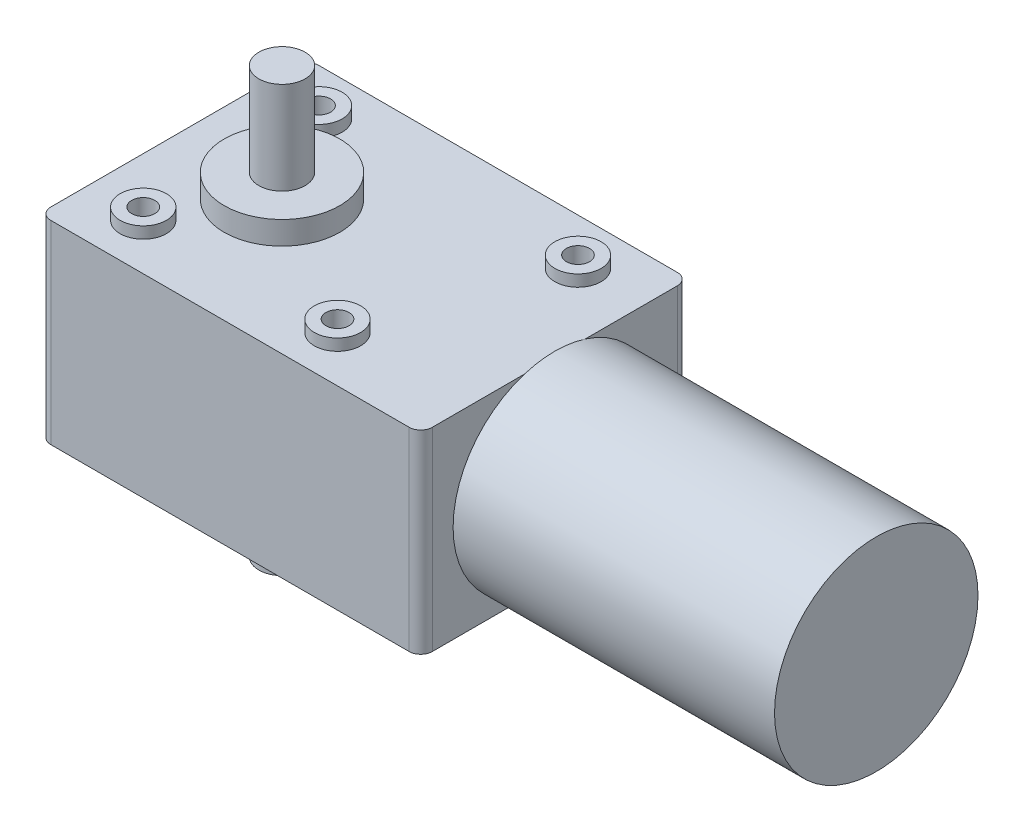
ISO-10303-21;
HEADER;
FILE_DESCRIPTION(('STEP AP214'),'2;1');
FILE_NAME('part.step','',(''),(''),'','','');
FILE_SCHEMA(('AUTOMOTIVE_DESIGN { 1 0 10303 214 1 1 1 1 }'));
ENDSEC;
DATA;
#1=APPLICATION_CONTEXT('core data for automotive mechanical design processes');
#2=APPLICATION_PROTOCOL_DEFINITION('international standard','automotive_design',2000,#1);
#3=PRODUCT_CONTEXT('',#1,'mechanical');
#4=PRODUCT('Part','Part','',(#3));
#5=PRODUCT_RELATED_PRODUCT_CATEGORY('part','',(#4));
#6=PRODUCT_DEFINITION_FORMATION('','',#4);
#7=PRODUCT_DEFINITION_CONTEXT('part definition',#1,'design');
#8=PRODUCT_DEFINITION('design','',#6,#7);
#9=PRODUCT_DEFINITION_SHAPE('','',#8);
#10=(LENGTH_UNIT() NAMED_UNIT(*) SI_UNIT(.MILLI.,.METRE.));
#11=(NAMED_UNIT(*) PLANE_ANGLE_UNIT() SI_UNIT($,.RADIAN.));
#12=(NAMED_UNIT(*) SI_UNIT($,.STERADIAN.) SOLID_ANGLE_UNIT());
#13=UNCERTAINTY_MEASURE_WITH_UNIT(LENGTH_MEASURE(1.E-05),#10,'distance_accuracy_value','');
#14=(GEOMETRIC_REPRESENTATION_CONTEXT(3) GLOBAL_UNCERTAINTY_ASSIGNED_CONTEXT((#13)) GLOBAL_UNIT_ASSIGNED_CONTEXT((#10,
#11,#12)) REPRESENTATION_CONTEXT('',''));
#15=CARTESIAN_POINT('',(0.,0.,0.));
#16=DIRECTION('',(0.,0.,1.));
#17=DIRECTION('',(1.,0.,0.));
#18=AXIS2_PLACEMENT_3D('',#15,#16,#17);
#19=CARTESIAN_POINT('',(-28.75,-23.5,19.));
#20=DIRECTION('',(0.,-1.,0.));
#21=DIRECTION('',(0.,0.,1.));
#22=AXIS2_PLACEMENT_3D('',#19,#20,#21);
#23=PLANE('',#22);
#24=CARTESIAN_POINT('',(-28.75,-23.5,19.));
#25=DIRECTION('',(0.,1.,0.));
#26=DIRECTION('',(0.,0.,1.));
#27=AXIS2_PLACEMENT_3D('',#24,#25,#26);
#28=CIRCLE('',#27,5.);
#29=CARTESIAN_POINT('',(-28.75,-23.5,24.));
#30=VERTEX_POINT('',#29);
#31=EDGE_CURVE('E350',#30,#30,#28,.T.);
#32=ORIENTED_EDGE('',*,*,#31,.F.);
#33=EDGE_LOOP('',(#32));
#34=FACE_BOUND('',#33,.T.);
#35=CARTESIAN_POINT('',(-28.75,-23.5,19.));
#36=DIRECTION('',(0.,1.,0.));
#37=DIRECTION('',(0.,0.,1.));
#38=AXIS2_PLACEMENT_3D('',#35,#36,#37);
#39=CIRCLE('',#38,2.5);
#40=CARTESIAN_POINT('',(-28.75,-23.5,21.5));
#41=VERTEX_POINT('',#40);
#42=EDGE_CURVE('E687',#41,#41,#39,.T.);
#43=ORIENTED_EDGE('',*,*,#42,.T.);
#44=EDGE_LOOP('',(#43));
#45=FACE_BOUND('',#44,.T.);
#46=ADVANCED_FACE('F33',(#34,#45),#23,.T.);
#47=CARTESIAN_POINT('',(13.25,-23.5,19.));
#48=DIRECTION('',(0.,-1.,0.));
#49=DIRECTION('',(0.,0.,1.));
#50=AXIS2_PLACEMENT_3D('',#47,#48,#49);
#51=PLANE('',#50);
#52=CARTESIAN_POINT('',(13.25,-23.5,19.));
#53=DIRECTION('',(0.,1.,0.));
#54=DIRECTION('',(0.,0.,1.));
#55=AXIS2_PLACEMENT_3D('',#52,#53,#54);
#56=CIRCLE('',#55,5.);
#57=CARTESIAN_POINT('',(13.25,-23.5,24.));
#58=VERTEX_POINT('',#57);
#59=EDGE_CURVE('E344',#58,#58,#56,.T.);
#60=ORIENTED_EDGE('',*,*,#59,.F.);
#61=EDGE_LOOP('',(#60));
#62=FACE_BOUND('',#61,.T.);
#63=CARTESIAN_POINT('',(13.25,-23.5,19.));
#64=DIRECTION('',(0.,1.,0.));
#65=DIRECTION('',(0.,0.,1.));
#66=AXIS2_PLACEMENT_3D('',#63,#64,#65);
#67=CIRCLE('',#66,2.5);
#68=CARTESIAN_POINT('',(13.25,-23.5,21.5));
#69=VERTEX_POINT('',#68);
#70=EDGE_CURVE('E692',#69,#69,#67,.T.);
#71=ORIENTED_EDGE('',*,*,#70,.T.);
#72=EDGE_LOOP('',(#71));
#73=FACE_BOUND('',#72,.T.);
#74=ADVANCED_FACE('F293',(#62,#73),#51,.T.);
#75=CARTESIAN_POINT('',(27.25,-23.5,-19.));
#76=DIRECTION('',(0.,-1.,0.));
#77=DIRECTION('',(0.,0.,1.));
#78=AXIS2_PLACEMENT_3D('',#75,#76,#77);
#79=PLANE('',#78);
#80=CARTESIAN_POINT('',(27.25,-23.5,-19.));
#81=DIRECTION('',(0.,1.,0.));
#82=DIRECTION('',(0.,0.,1.));
#83=AXIS2_PLACEMENT_3D('',#80,#81,#82);
#84=CIRCLE('',#83,5.);
#85=CARTESIAN_POINT('',(27.25,-23.5,-14.));
#86=VERTEX_POINT('',#85);
#87=EDGE_CURVE('E338',#86,#86,#84,.T.);
#88=ORIENTED_EDGE('',*,*,#87,.F.);
#89=EDGE_LOOP('',(#88));
#90=FACE_BOUND('',#89,.T.);
#91=CARTESIAN_POINT('',(27.25,-23.5,-19.));
#92=DIRECTION('',(0.,1.,0.));
#93=DIRECTION('',(0.,0.,1.));
#94=AXIS2_PLACEMENT_3D('',#91,#92,#93);
#95=CIRCLE('',#94,2.5);
#96=CARTESIAN_POINT('',(27.25,-23.5,-16.5));
#97=VERTEX_POINT('',#96);
#98=EDGE_CURVE('E334',#97,#97,#95,.T.);
#99=ORIENTED_EDGE('',*,*,#98,.T.);
#100=EDGE_LOOP('',(#99));
#101=FACE_BOUND('',#100,.T.);
#102=ADVANCED_FACE('F299',(#90,#101),#79,.T.);
#103=CARTESIAN_POINT('',(-28.75,-23.5,-19.));
#104=DIRECTION('',(0.,-1.,0.));
#105=DIRECTION('',(0.,0.,1.));
#106=AXIS2_PLACEMENT_3D('',#103,#104,#105);
#107=PLANE('',#106);
#108=CARTESIAN_POINT('',(-28.75,-23.5,-19.));
#109=DIRECTION('',(0.,1.,0.));
#110=DIRECTION('',(0.,0.,1.));
#111=AXIS2_PLACEMENT_3D('',#108,#109,#110);
#112=CIRCLE('',#111,5.);
#113=CARTESIAN_POINT('',(-28.75,-23.5,-14.));
#114=VERTEX_POINT('',#113);
#115=EDGE_CURVE('E132',#114,#114,#112,.T.);
#116=ORIENTED_EDGE('',*,*,#115,.F.);
#117=EDGE_LOOP('',(#116));
#118=FACE_BOUND('',#117,.T.);
#119=CARTESIAN_POINT('',(-28.75,-23.5,-19.));
#120=DIRECTION('',(0.,1.,0.));
#121=DIRECTION('',(0.,0.,1.));
#122=AXIS2_PLACEMENT_3D('',#119,#120,#121);
#123=CIRCLE('',#122,2.5);
#124=CARTESIAN_POINT('',(-28.75,-23.5,-16.5));
#125=VERTEX_POINT('',#124);
#126=EDGE_CURVE('E325',#125,#125,#123,.T.);
#127=ORIENTED_EDGE('',*,*,#126,.T.);
#128=EDGE_LOOP('',(#127));
#129=FACE_BOUND('',#128,.T.);
#130=ADVANCED_FACE('F310',(#118,#129),#107,.T.);
#131=CARTESIAN_POINT('',(41.25,21.,26.5));
#132=DIRECTION('',(-1.,0.,0.));
#133=DIRECTION('',(0.,0.,1.));
#134=AXIS2_PLACEMENT_3D('',#131,#132,#133);
#135=PLANE('',#134);
#136=CARTESIAN_POINT('',(41.25,0.,0.));
#137=DIRECTION('',(1.,0.,0.));
#138=DIRECTION('',(0.,0.,-1.));
#139=AXIS2_PLACEMENT_3D('',#136,#137,#138);
#140=CIRCLE('',#139,22.);
#141=CARTESIAN_POINT('',(41.25,-21.,-6.55743852430199));
#142=VERTEX_POINT('',#141);
#143=CARTESIAN_POINT('',(41.25,21.,-6.557438524302));
#144=VERTEX_POINT('',#143);
#145=EDGE_CURVE('E125',#142,#144,#140,.T.);
#146=ORIENTED_EDGE('',*,*,#145,.F.);
#147=DIRECTION('',(0.,0.,-1.));
#148=VECTOR('',#147,1.);
#149=CARTESIAN_POINT('',(41.25,-21.,26.5));
#150=LINE('',#149,#148);
#151=CARTESIAN_POINT('',(41.25,-21.,-26.5));
#152=VERTEX_POINT('',#151);
#153=EDGE_CURVE('E112',#142,#152,#150,.T.);
#154=ORIENTED_EDGE('',*,*,#153,.T.);
#155=DIRECTION('',(0.,-1.,0.));
#156=VECTOR('',#155,1.);
#157=CARTESIAN_POINT('',(41.25,21.,-26.5));
#158=LINE('',#157,#156);
#159=CARTESIAN_POINT('',(41.25,21.,-26.5));
#160=VERTEX_POINT('',#159);
#161=EDGE_CURVE('E247',#160,#152,#158,.T.);
#162=ORIENTED_EDGE('',*,*,#161,.F.);
#163=DIRECTION('',(0.,0.,-1.));
#164=VECTOR('',#163,1.);
#165=CARTESIAN_POINT('',(41.25,21.,26.5));
#166=LINE('',#165,#164);
#167=EDGE_CURVE('E48',#144,#160,#166,.T.);
#168=ORIENTED_EDGE('',*,*,#167,.F.);
#169=EDGE_LOOP('',(#146,#154,#162,#168));
#170=FACE_BOUND('',#169,.T.);
#171=ADVANCED_FACE('F126',(#170),#135,.F.);
#172=CARTESIAN_POINT('',(41.25,21.,6.557438524302));
#173=VERTEX_POINT('',#172);
#174=CARTESIAN_POINT('',(41.25,-21.,6.55743852430199));
#175=VERTEX_POINT('',#174);
#176=EDGE_CURVE('E56',#173,#175,#140,.T.);
#177=ORIENTED_EDGE('',*,*,#176,.F.);
#178=CARTESIAN_POINT('',(41.25,21.,26.5));
#179=VERTEX_POINT('',#178);
#180=EDGE_CURVE('E214',#179,#173,#166,.T.);
#181=ORIENTED_EDGE('',*,*,#180,.F.);
#182=DIRECTION('',(0.,-1.,0.));
#183=VECTOR('',#182,1.);
#184=CARTESIAN_POINT('',(41.25,21.,26.5));
#185=LINE('',#184,#183);
#186=CARTESIAN_POINT('',(41.25,-21.,26.5));
#187=VERTEX_POINT('',#186);
#188=EDGE_CURVE('E249',#179,#187,#185,.T.);
#189=ORIENTED_EDGE('',*,*,#188,.T.);
#190=EDGE_CURVE('E123',#187,#175,#150,.T.);
#191=ORIENTED_EDGE('',*,*,#190,.T.);
#192=EDGE_LOOP('',(#177,#181,#189,#191));
#193=FACE_BOUND('',#192,.T.);
#194=ADVANCED_FACE('F269',(#193),#135,.F.);
#195=CARTESIAN_POINT('',(-17.75,26.,0.));
#196=DIRECTION('',(0.,1.,0.));
#197=DIRECTION('',(0.,0.,1.));
#198=AXIS2_PLACEMENT_3D('',#195,#196,#197);
#199=PLANE('',#198);
#200=CARTESIAN_POINT('',(-17.75,26.,0.));
#201=DIRECTION('',(0.,1.,0.));
#202=DIRECTION('',(0.,0.,1.));
#203=AXIS2_PLACEMENT_3D('',#200,#201,#202);
#204=CIRCLE('',#203,12.5);
#205=CARTESIAN_POINT('',(-17.75,26.,12.5));
#206=VERTEX_POINT('',#205);
#207=EDGE_CURVE('E152',#206,#206,#204,.T.);
#208=ORIENTED_EDGE('',*,*,#207,.T.);
#209=EDGE_LOOP('',(#208));
#210=FACE_BOUND('',#209,.T.);
#211=CARTESIAN_POINT('',(-17.75,26.,0.));
#212=DIRECTION('',(0.,1.,0.));
#213=DIRECTION('',(0.,0.,1.));
#214=AXIS2_PLACEMENT_3D('',#211,#212,#213);
#215=CIRCLE('',#214,5.);
#216=CARTESIAN_POINT('',(-17.75,26.,5.));
#217=VERTEX_POINT('',#216);
#218=EDGE_CURVE('E145',#217,#217,#215,.T.);
#219=ORIENTED_EDGE('',*,*,#218,.F.);
#220=EDGE_LOOP('',(#219));
#221=FACE_BOUND('',#220,.T.);
#222=ADVANCED_FACE('F398',(#210,#221),#199,.T.);
#223=CARTESIAN_POINT('',(-38.75,21.,26.5));
#224=DIRECTION('',(0.,1.,0.));
#225=DIRECTION('',(0.,0.,1.));
#226=AXIS2_PLACEMENT_3D('',#223,#224,#225);
#227=PLANE('',#226);
#228=CARTESIAN_POINT('',(27.25,21.,-19.));
#229=DIRECTION('',(0.,1.,0.));
#230=DIRECTION('',(0.,0.,1.));
#231=AXIS2_PLACEMENT_3D('',#228,#229,#230);
#232=CIRCLE('',#231,5.);
#233=CARTESIAN_POINT('',(27.25,21.,-14.));
#234=VERTEX_POINT('',#233);
#235=EDGE_CURVE('E179',#234,#234,#232,.T.);
#236=ORIENTED_EDGE('',*,*,#235,.F.);
#237=EDGE_LOOP('',(#236));
#238=FACE_BOUND('',#237,.T.);
#239=CARTESIAN_POINT('',(-28.75,21.,19.));
#240=DIRECTION('',(0.,1.,0.));
#241=DIRECTION('',(0.,0.,1.));
#242=AXIS2_PLACEMENT_3D('',#239,#240,#241);
#243=CIRCLE('',#242,5.);
#244=CARTESIAN_POINT('',(-28.75,21.,24.));
#245=VERTEX_POINT('',#244);
#246=EDGE_CURVE('E191',#245,#245,#243,.T.);
#247=ORIENTED_EDGE('',*,*,#246,.F.);
#248=EDGE_LOOP('',(#247));
#249=FACE_BOUND('',#248,.T.);
#250=CARTESIAN_POINT('',(-38.75,21.,26.5));
#251=DIRECTION('',(0.,1.,0.));
#252=DIRECTION('',(0.,0.,1.));
#253=AXIS2_PLACEMENT_3D('',#250,#251,#252);
#254=CIRCLE('',#253,2.5);
#255=CARTESIAN_POINT('',(-41.25,21.,26.5));
#256=VERTEX_POINT('',#255);
#257=CARTESIAN_POINT('',(-38.75,21.,29.));
#258=VERTEX_POINT('',#257);
#259=EDGE_CURVE('E206',#256,#258,#254,.T.);
#260=ORIENTED_EDGE('',*,*,#259,.T.);
#261=DIRECTION('',(1.,0.,0.));
#262=VECTOR('',#261,1.);
#263=CARTESIAN_POINT('',(-38.75,21.,29.));
#264=LINE('',#263,#262);
#265=CARTESIAN_POINT('',(38.75,21.,29.));
#266=VERTEX_POINT('',#265);
#267=EDGE_CURVE('E209',#258,#266,#264,.T.);
#268=ORIENTED_EDGE('',*,*,#267,.T.);
#269=CARTESIAN_POINT('',(38.75,21.,26.5));
#270=DIRECTION('',(0.,1.,0.));
#271=DIRECTION('',(0.,0.,1.));
#272=AXIS2_PLACEMENT_3D('',#269,#270,#271);
#273=CIRCLE('',#272,2.5);
#274=EDGE_CURVE('E212',#266,#179,#273,.T.);
#275=ORIENTED_EDGE('',*,*,#274,.T.);
#276=ORIENTED_EDGE('',*,*,#180,.T.);
#277=DIRECTION('',(0.,0.,-1.));
#278=VECTOR('',#277,1.);
#279=CARTESIAN_POINT('',(41.25,21.,26.5));
#280=LINE('',#279,#278);
#281=EDGE_CURVE('E143',#173,#144,#280,.T.);
#282=ORIENTED_EDGE('',*,*,#281,.T.);
#283=ORIENTED_EDGE('',*,*,#167,.T.);
#284=CARTESIAN_POINT('',(38.75,21.,-26.5));
#285=DIRECTION('',(0.,1.,0.));
#286=DIRECTION('',(0.,0.,1.));
#287=AXIS2_PLACEMENT_3D('',#284,#285,#286);
#288=CIRCLE('',#287,2.5);
#289=CARTESIAN_POINT('',(38.75,21.,-29.));
#290=VERTEX_POINT('',#289);
#291=EDGE_CURVE('E216',#160,#290,#288,.T.);
#292=ORIENTED_EDGE('',*,*,#291,.T.);
#293=DIRECTION('',(-1.,0.,0.));
#294=VECTOR('',#293,1.);
#295=CARTESIAN_POINT('',(-38.75,21.,-29.));
#296=LINE('',#295,#294);
#297=CARTESIAN_POINT('',(-38.75,21.,-29.));
#298=VERTEX_POINT('',#297);
#299=EDGE_CURVE('E218',#290,#298,#296,.T.);
#300=ORIENTED_EDGE('',*,*,#299,.T.);
#301=CARTESIAN_POINT('',(-38.75,21.,-26.5));
#302=DIRECTION('',(0.,1.,0.));
#303=DIRECTION('',(0.,0.,-1.));
#304=AXIS2_PLACEMENT_3D('',#301,#302,#303);
#305=CIRCLE('',#304,2.5);
#306=CARTESIAN_POINT('',(-41.25,21.,-26.5));
#307=VERTEX_POINT('',#306);
#308=EDGE_CURVE('E220',#298,#307,#305,.T.);
#309=ORIENTED_EDGE('',*,*,#308,.T.);
#310=DIRECTION('',(0.,0.,1.));
#311=VECTOR('',#310,1.);
#312=CARTESIAN_POINT('',(-41.25,21.,26.5));
#313=LINE('',#312,#311);
#314=EDGE_CURVE('E222',#307,#256,#313,.T.);
#315=ORIENTED_EDGE('',*,*,#314,.T.);
#316=EDGE_LOOP('',(#260,#268,#275,#276,#282,#283,#292,#300,#309,#315));
#317=FACE_BOUND('',#316,.T.);
#318=CARTESIAN_POINT('',(-28.75,21.,-19.));
#319=DIRECTION('',(0.,1.,0.));
#320=DIRECTION('',(0.,0.,1.));
#321=AXIS2_PLACEMENT_3D('',#318,#319,#320);
#322=CIRCLE('',#321,5.);
#323=CARTESIAN_POINT('',(-28.75,21.,-14.));
#324=VERTEX_POINT('',#323);
#325=EDGE_CURVE('E197',#324,#324,#322,.T.);
#326=ORIENTED_EDGE('',*,*,#325,.F.);
#327=EDGE_LOOP('',(#326));
#328=FACE_BOUND('',#327,.T.);
#329=CARTESIAN_POINT('',(13.25,21.,19.));
#330=DIRECTION('',(0.,1.,0.));
#331=DIRECTION('',(0.,0.,1.));
#332=AXIS2_PLACEMENT_3D('',#329,#330,#331);
#333=CIRCLE('',#332,5.);
#334=CARTESIAN_POINT('',(13.25,21.,24.));
#335=VERTEX_POINT('',#334);
#336=EDGE_CURVE('E185',#335,#335,#333,.T.);
#337=ORIENTED_EDGE('',*,*,#336,.F.);
#338=EDGE_LOOP('',(#337));
#339=FACE_BOUND('',#338,.T.);
#340=CARTESIAN_POINT('',(-17.75,21.,0.));
#341=DIRECTION('',(0.,1.,0.));
#342=DIRECTION('',(0.,0.,1.));
#343=AXIS2_PLACEMENT_3D('',#340,#341,#342);
#344=CIRCLE('',#343,12.5);
#345=CARTESIAN_POINT('',(-17.75,21.,12.5));
#346=VERTEX_POINT('',#345);
#347=EDGE_CURVE('E149',#346,#346,#344,.T.);
#348=ORIENTED_EDGE('',*,*,#347,.F.);
#349=EDGE_LOOP('',(#348));
#350=FACE_BOUND('',#349,.T.);
#351=ADVANCED_FACE('F272',(#238,#249,#317,#328,#339,#350),#227,.T.);
#352=CARTESIAN_POINT('',(-38.75,21.,26.5));
#353=DIRECTION('',(0.,-1.,0.));
#354=DIRECTION('',(0.,0.,-1.));
#355=AXIS2_PLACEMENT_3D('',#352,#353,#354);
#356=CYLINDRICAL_SURFACE('',#355,2.5);
#357=CARTESIAN_POINT('',(-38.75,-21.,26.5));
#358=DIRECTION('',(0.,1.,0.));
#359=DIRECTION('',(0.,0.,1.));
#360=AXIS2_PLACEMENT_3D('',#357,#358,#359);
#361=CIRCLE('',#360,2.5);
#362=CARTESIAN_POINT('',(-41.25,-21.,26.5));
#363=VERTEX_POINT('',#362);
#364=CARTESIAN_POINT('',(-38.75,-21.,29.));
#365=VERTEX_POINT('',#364);
#366=EDGE_CURVE('E203',#363,#365,#361,.T.);
#367=ORIENTED_EDGE('',*,*,#366,.T.);
#368=DIRECTION('',(0.,-1.,0.));
#369=VECTOR('',#368,1.);
#370=CARTESIAN_POINT('',(-38.75,21.,29.));
#371=LINE('',#370,#369);
#372=EDGE_CURVE('E41',#258,#365,#371,.T.);
#373=ORIENTED_EDGE('',*,*,#372,.F.);
#374=ORIENTED_EDGE('',*,*,#259,.F.);
#375=DIRECTION('',(0.,-1.,0.));
#376=VECTOR('',#375,1.);
#377=CARTESIAN_POINT('',(-41.25,21.,26.5));
#378=LINE('',#377,#376);
#379=EDGE_CURVE('E224',#256,#363,#378,.T.);
#380=ORIENTED_EDGE('',*,*,#379,.T.);
#381=EDGE_LOOP('',(#367,#373,#374,#380));
#382=FACE_BOUND('',#381,.T.);
#383=ADVANCED_FACE('F35',(#382),#356,.T.);
#384=CARTESIAN_POINT('',(-38.75,21.,29.));
#385=DIRECTION('',(0.,0.,-1.));
#386=DIRECTION('',(-1.,0.,0.));
#387=AXIS2_PLACEMENT_3D('',#384,#385,#386);
#388=PLANE('',#387);
#389=DIRECTION('',(1.,0.,0.));
#390=VECTOR('',#389,1.);
#391=CARTESIAN_POINT('',(-38.75,-21.,29.));
#392=LINE('',#391,#390);
#393=CARTESIAN_POINT('',(38.75,-21.,29.));
#394=VERTEX_POINT('',#393);
#395=EDGE_CURVE('E227',#365,#394,#392,.T.);
#396=ORIENTED_EDGE('',*,*,#395,.T.);
#397=DIRECTION('',(0.,-1.,0.));
#398=VECTOR('',#397,1.);
#399=CARTESIAN_POINT('',(38.75,21.,29.));
#400=LINE('',#399,#398);
#401=EDGE_CURVE('E252',#266,#394,#400,.T.);
#402=ORIENTED_EDGE('',*,*,#401,.F.);
#403=ORIENTED_EDGE('',*,*,#267,.F.);
#404=ORIENTED_EDGE('',*,*,#372,.T.);
#405=EDGE_LOOP('',(#396,#402,#403,#404));
#406=FACE_BOUND('',#405,.T.);
#407=ADVANCED_FACE('F257',(#406),#388,.F.);
#408=CARTESIAN_POINT('',(38.75,21.,26.5));
#409=DIRECTION('',(0.,-1.,0.));
#410=DIRECTION('',(0.,0.,-1.));
#411=AXIS2_PLACEMENT_3D('',#408,#409,#410);
#412=CYLINDRICAL_SURFACE('',#411,2.5);
#413=CARTESIAN_POINT('',(38.75,-21.,26.5));
#414=DIRECTION('',(0.,1.,0.));
#415=DIRECTION('',(0.,0.,1.));
#416=AXIS2_PLACEMENT_3D('',#413,#414,#415);
#417=CIRCLE('',#416,2.5);
#418=EDGE_CURVE('E121',#394,#187,#417,.T.);
#419=ORIENTED_EDGE('',*,*,#418,.T.);
#420=ORIENTED_EDGE('',*,*,#188,.F.);
#421=ORIENTED_EDGE('',*,*,#274,.F.);
#422=ORIENTED_EDGE('',*,*,#401,.T.);
#423=EDGE_LOOP('',(#419,#420,#421,#422));
#424=FACE_BOUND('',#423,.T.);
#425=ADVANCED_FACE('F267',(#424),#412,.T.);
#426=CARTESIAN_POINT('',(38.75,21.,-26.5));
#427=DIRECTION('',(0.,-1.,0.));
#428=DIRECTION('',(0.,0.,-1.));
#429=AXIS2_PLACEMENT_3D('',#426,#427,#428);
#430=CYLINDRICAL_SURFACE('',#429,2.5);
#431=CARTESIAN_POINT('',(38.75,-21.,-26.5));
#432=DIRECTION('',(0.,1.,0.));
#433=DIRECTION('',(0.,0.,1.));
#434=AXIS2_PLACEMENT_3D('',#431,#432,#433);
#435=CIRCLE('',#434,2.5);
#436=CARTESIAN_POINT('',(38.75,-21.,-29.));
#437=VERTEX_POINT('',#436);
#438=EDGE_CURVE('E119',#152,#437,#435,.T.);
#439=ORIENTED_EDGE('',*,*,#438,.T.);
#440=DIRECTION('',(0.,-1.,0.));
#441=VECTOR('',#440,1.);
#442=CARTESIAN_POINT('',(38.75,21.,-29.));
#443=LINE('',#442,#441);
#444=EDGE_CURVE('E244',#290,#437,#443,.T.);
#445=ORIENTED_EDGE('',*,*,#444,.F.);
#446=ORIENTED_EDGE('',*,*,#291,.F.);
#447=ORIENTED_EDGE('',*,*,#161,.T.);
#448=EDGE_LOOP('',(#439,#445,#446,#447));
#449=FACE_BOUND('',#448,.T.);
#450=ADVANCED_FACE('F385',(#449),#430,.T.);
#451=CARTESIAN_POINT('',(-38.75,21.,-29.));
#452=DIRECTION('',(0.,0.,1.));
#453=DIRECTION('',(1.,0.,0.));
#454=AXIS2_PLACEMENT_3D('',#451,#452,#453);
#455=PLANE('',#454);
#456=DIRECTION('',(-1.,0.,0.));
#457=VECTOR('',#456,1.);
#458=CARTESIAN_POINT('',(-38.75,-21.,-29.));
#459=LINE('',#458,#457);
#460=CARTESIAN_POINT('',(-38.75,-21.,-29.));
#461=VERTEX_POINT('',#460);
#462=EDGE_CURVE('E231',#437,#461,#459,.T.);
#463=ORIENTED_EDGE('',*,*,#462,.T.);
#464=DIRECTION('',(0.,-1.,0.));
#465=VECTOR('',#464,1.);
#466=CARTESIAN_POINT('',(-38.75,21.,-29.));
#467=LINE('',#466,#465);
#468=EDGE_CURVE('E241',#298,#461,#467,.T.);
#469=ORIENTED_EDGE('',*,*,#468,.F.);
#470=ORIENTED_EDGE('',*,*,#299,.F.);
#471=ORIENTED_EDGE('',*,*,#444,.T.);
#472=EDGE_LOOP('',(#463,#469,#470,#471));
#473=FACE_BOUND('',#472,.T.);
#474=ADVANCED_FACE('F381',(#473),#455,.F.);
#475=CARTESIAN_POINT('',(-38.75,21.,-26.5));
#476=DIRECTION('',(0.,-1.,0.));
#477=DIRECTION('',(0.,0.,-1.));
#478=AXIS2_PLACEMENT_3D('',#475,#476,#477);
#479=CYLINDRICAL_SURFACE('',#478,2.5);
#480=CARTESIAN_POINT('',(-38.75,-21.,-26.5));
#481=DIRECTION('',(0.,1.,0.));
#482=DIRECTION('',(0.,0.,-1.));
#483=AXIS2_PLACEMENT_3D('',#480,#481,#482);
#484=CIRCLE('',#483,2.5);
#485=CARTESIAN_POINT('',(-41.25,-21.,-26.5));
#486=VERTEX_POINT('',#485);
#487=EDGE_CURVE('E233',#461,#486,#484,.T.);
#488=ORIENTED_EDGE('',*,*,#487,.T.);
#489=DIRECTION('',(0.,-1.,0.));
#490=VECTOR('',#489,1.);
#491=CARTESIAN_POINT('',(-41.25,21.,-26.5));
#492=LINE('',#491,#490);
#493=EDGE_CURVE('E238',#307,#486,#492,.T.);
#494=ORIENTED_EDGE('',*,*,#493,.F.);
#495=ORIENTED_EDGE('',*,*,#308,.F.);
#496=ORIENTED_EDGE('',*,*,#468,.T.);
#497=EDGE_LOOP('',(#488,#494,#495,#496));
#498=FACE_BOUND('',#497,.T.);
#499=ADVANCED_FACE('F372',(#498),#479,.T.);
#500=CARTESIAN_POINT('',(-41.25,21.,26.5));
#501=DIRECTION('',(1.,0.,0.));
#502=DIRECTION('',(0.,0.,-1.));
#503=AXIS2_PLACEMENT_3D('',#500,#501,#502);
#504=PLANE('',#503);
#505=DIRECTION('',(0.,0.,1.));
#506=VECTOR('',#505,1.);
#507=CARTESIAN_POINT('',(-41.25,-21.,26.5));
#508=LINE('',#507,#506);
#509=EDGE_CURVE('E210',#486,#363,#508,.T.);
#510=ORIENTED_EDGE('',*,*,#509,.T.);
#511=ORIENTED_EDGE('',*,*,#379,.F.);
#512=ORIENTED_EDGE('',*,*,#314,.F.);
#513=ORIENTED_EDGE('',*,*,#493,.T.);
#514=EDGE_LOOP('',(#510,#511,#512,#513));
#515=FACE_BOUND('',#514,.T.);
#516=ADVANCED_FACE('F362',(#515),#504,.F.);
#517=CARTESIAN_POINT('',(-38.75,-21.,26.5));
#518=DIRECTION('',(0.,1.,0.));
#519=DIRECTION('',(0.,0.,1.));
#520=AXIS2_PLACEMENT_3D('',#517,#518,#519);
#521=PLANE('',#520);
#522=CARTESIAN_POINT('',(-17.75,-21.,0.));
#523=DIRECTION('',(0.,1.,0.));
#524=DIRECTION('',(0.,0.,1.));
#525=AXIS2_PLACEMENT_3D('',#522,#523,#524);
#526=CIRCLE('',#525,12.5);
#527=CARTESIAN_POINT('',(-17.75,-21.,12.5));
#528=VERTEX_POINT('',#527);
#529=EDGE_CURVE('E681',#528,#528,#526,.T.);
#530=ORIENTED_EDGE('',*,*,#529,.T.);
#531=EDGE_LOOP('',(#530));
#532=FACE_BOUND('',#531,.T.);
#533=CARTESIAN_POINT('',(27.25,-21.,-19.));
#534=DIRECTION('',(0.,1.,0.));
#535=DIRECTION('',(0.,0.,1.));
#536=AXIS2_PLACEMENT_3D('',#533,#534,#535);
#537=CIRCLE('',#536,5.);
#538=CARTESIAN_POINT('',(27.25,-21.,-14.));
#539=VERTEX_POINT('',#538);
#540=EDGE_CURVE('E331',#539,#539,#537,.T.);
#541=ORIENTED_EDGE('',*,*,#540,.T.);
#542=EDGE_LOOP('',(#541));
#543=FACE_BOUND('',#542,.T.);
#544=CARTESIAN_POINT('',(13.25,-21.,19.));
#545=DIRECTION('',(0.,1.,0.));
#546=DIRECTION('',(0.,0.,1.));
#547=AXIS2_PLACEMENT_3D('',#544,#545,#546);
#548=CIRCLE('',#547,5.);
#549=CARTESIAN_POINT('',(13.25,-21.,24.));
#550=VERTEX_POINT('',#549);
#551=EDGE_CURVE('E341',#550,#550,#548,.T.);
#552=ORIENTED_EDGE('',*,*,#551,.T.);
#553=EDGE_LOOP('',(#552));
#554=FACE_BOUND('',#553,.T.);
#555=CARTESIAN_POINT('',(-28.75,-21.,19.));
#556=DIRECTION('',(0.,1.,0.));
#557=DIRECTION('',(0.,0.,1.));
#558=AXIS2_PLACEMENT_3D('',#555,#556,#557);
#559=CIRCLE('',#558,5.);
#560=CARTESIAN_POINT('',(-28.75,-21.,24.));
#561=VERTEX_POINT('',#560);
#562=EDGE_CURVE('E347',#561,#561,#559,.T.);
#563=ORIENTED_EDGE('',*,*,#562,.T.);
#564=EDGE_LOOP('',(#563));
#565=FACE_BOUND('',#564,.T.);
#566=CARTESIAN_POINT('',(-28.75,-21.,-19.));
#567=DIRECTION('',(0.,1.,0.));
#568=DIRECTION('',(0.,0.,1.));
#569=AXIS2_PLACEMENT_3D('',#566,#567,#568);
#570=CIRCLE('',#569,5.);
#571=CARTESIAN_POINT('',(-28.75,-21.,-14.));
#572=VERTEX_POINT('',#571);
#573=EDGE_CURVE('E353',#572,#572,#570,.T.);
#574=ORIENTED_EDGE('',*,*,#573,.T.);
#575=EDGE_LOOP('',(#574));
#576=FACE_BOUND('',#575,.T.);
#577=ORIENTED_EDGE('',*,*,#366,.F.);
#578=ORIENTED_EDGE('',*,*,#509,.F.);
#579=ORIENTED_EDGE('',*,*,#487,.F.);
#580=ORIENTED_EDGE('',*,*,#462,.F.);
#581=ORIENTED_EDGE('',*,*,#438,.F.);
#582=ORIENTED_EDGE('',*,*,#153,.F.);
#583=EDGE_CURVE('E117',#175,#142,#150,.T.);
#584=ORIENTED_EDGE('',*,*,#583,.F.);
#585=ORIENTED_EDGE('',*,*,#190,.F.);
#586=ORIENTED_EDGE('',*,*,#418,.F.);
#587=ORIENTED_EDGE('',*,*,#395,.F.);
#588=EDGE_LOOP('',(#577,#578,#579,#580,#581,#582,#584,#585,#586,#587));
#589=FACE_BOUND('',#588,.T.);
#590=ADVANCED_FACE('F114',(#532,#543,#554,#565,#576,#589),#521,.F.);
#591=CARTESIAN_POINT('',(-28.75,23.5,-19.));
#592=DIRECTION('',(0.,-1.,0.));
#593=DIRECTION('',(0.,0.,-1.));
#594=AXIS2_PLACEMENT_3D('',#591,#592,#593);
#595=CYLINDRICAL_SURFACE('',#594,5.);
#596=CARTESIAN_POINT('',(-28.75,23.5,-19.));
#597=DIRECTION('',(0.,1.,0.));
#598=DIRECTION('',(0.,0.,1.));
#599=AXIS2_PLACEMENT_3D('',#596,#597,#598);
#600=CIRCLE('',#599,5.);
#601=CARTESIAN_POINT('',(-28.75,23.5,-14.));
#602=VERTEX_POINT('',#601);
#603=EDGE_CURVE('E200',#602,#602,#600,.T.);
#604=ORIENTED_EDGE('',*,*,#603,.F.);
#605=EDGE_LOOP('',(#604));
#606=FACE_BOUND('',#605,.T.);
#607=ORIENTED_EDGE('',*,*,#325,.T.);
#608=EDGE_LOOP('',(#607));
#609=FACE_BOUND('',#608,.T.);
#610=ADVANCED_FACE('F361',(#606,#609),#595,.T.);
#611=CARTESIAN_POINT('',(-28.75,23.5,-19.));
#612=DIRECTION('',(0.,1.,0.));
#613=DIRECTION('',(0.,0.,1.));
#614=AXIS2_PLACEMENT_3D('',#611,#612,#613);
#615=PLANE('',#614);
#616=CARTESIAN_POINT('',(-28.75,23.5,-19.));
#617=DIRECTION('',(0.,1.,0.));
#618=DIRECTION('',(0.,0.,1.));
#619=AXIS2_PLACEMENT_3D('',#616,#617,#618);
#620=CIRCLE('',#619,2.5);
#621=CARTESIAN_POINT('',(-28.75,23.5,-16.5));
#622=VERTEX_POINT('',#621);
#623=EDGE_CURVE('E173',#622,#622,#620,.T.);
#624=ORIENTED_EDGE('',*,*,#623,.F.);
#625=EDGE_LOOP('',(#624));
#626=FACE_BOUND('',#625,.T.);
#627=ORIENTED_EDGE('',*,*,#603,.T.);
#628=EDGE_LOOP('',(#627));
#629=FACE_BOUND('',#628,.T.);
#630=ADVANCED_FACE('F369',(#626,#629),#615,.T.);
#631=CARTESIAN_POINT('',(-28.75,23.5,19.));
#632=DIRECTION('',(0.,-1.,0.));
#633=DIRECTION('',(0.,0.,-1.));
#634=AXIS2_PLACEMENT_3D('',#631,#632,#633);
#635=CYLINDRICAL_SURFACE('',#634,5.);
#636=CARTESIAN_POINT('',(-28.75,23.5,19.));
#637=DIRECTION('',(0.,1.,0.));
#638=DIRECTION('',(0.,0.,1.));
#639=AXIS2_PLACEMENT_3D('',#636,#637,#638);
#640=CIRCLE('',#639,5.);
#641=CARTESIAN_POINT('',(-28.75,23.5,24.));
#642=VERTEX_POINT('',#641);
#643=EDGE_CURVE('E194',#642,#642,#640,.T.);
#644=ORIENTED_EDGE('',*,*,#643,.F.);
#645=EDGE_LOOP('',(#644));
#646=FACE_BOUND('',#645,.T.);
#647=ORIENTED_EDGE('',*,*,#246,.T.);
#648=EDGE_LOOP('',(#647));
#649=FACE_BOUND('',#648,.T.);
#650=ADVANCED_FACE('F409',(#646,#649),#635,.T.);
#651=CARTESIAN_POINT('',(-28.75,23.5,19.));
#652=DIRECTION('',(0.,1.,0.));
#653=DIRECTION('',(0.,0.,1.));
#654=AXIS2_PLACEMENT_3D('',#651,#652,#653);
#655=PLANE('',#654);
#656=CARTESIAN_POINT('',(-28.75,23.5,19.));
#657=DIRECTION('',(0.,1.,0.));
#658=DIRECTION('',(0.,0.,1.));
#659=AXIS2_PLACEMENT_3D('',#656,#657,#658);
#660=CIRCLE('',#659,2.5);
#661=CARTESIAN_POINT('',(-28.75,23.5,21.5));
#662=VERTEX_POINT('',#661);
#663=EDGE_CURVE('E155',#662,#662,#660,.T.);
#664=ORIENTED_EDGE('',*,*,#663,.F.);
#665=EDGE_LOOP('',(#664));
#666=FACE_BOUND('',#665,.T.);
#667=ORIENTED_EDGE('',*,*,#643,.T.);
#668=EDGE_LOOP('',(#667));
#669=FACE_BOUND('',#668,.T.);
#670=ADVANCED_FACE('F411',(#666,#669),#655,.T.);
#671=CARTESIAN_POINT('',(13.25,23.5,19.));
#672=DIRECTION('',(0.,-1.,0.));
#673=DIRECTION('',(0.,0.,-1.));
#674=AXIS2_PLACEMENT_3D('',#671,#672,#673);
#675=CYLINDRICAL_SURFACE('',#674,5.);
#676=CARTESIAN_POINT('',(13.25,23.5,19.));
#677=DIRECTION('',(0.,1.,0.));
#678=DIRECTION('',(0.,0.,1.));
#679=AXIS2_PLACEMENT_3D('',#676,#677,#678);
#680=CIRCLE('',#679,5.);
#681=CARTESIAN_POINT('',(13.25,23.5,24.));
#682=VERTEX_POINT('',#681);
#683=EDGE_CURVE('E188',#682,#682,#680,.T.);
#684=ORIENTED_EDGE('',*,*,#683,.F.);
#685=EDGE_LOOP('',(#684));
#686=FACE_BOUND('',#685,.T.);
#687=ORIENTED_EDGE('',*,*,#336,.T.);
#688=EDGE_LOOP('',(#687));
#689=FACE_BOUND('',#688,.T.);
#690=ADVANCED_FACE('F418',(#686,#689),#675,.T.);
#691=CARTESIAN_POINT('',(13.25,23.5,19.));
#692=DIRECTION('',(0.,1.,0.));
#693=DIRECTION('',(0.,0.,1.));
#694=AXIS2_PLACEMENT_3D('',#691,#692,#693);
#695=PLANE('',#694);
#696=CARTESIAN_POINT('',(13.25,23.5,19.));
#697=DIRECTION('',(0.,1.,0.));
#698=DIRECTION('',(0.,0.,1.));
#699=AXIS2_PLACEMENT_3D('',#696,#697,#698);
#700=CIRCLE('',#699,2.5);
#701=CARTESIAN_POINT('',(13.25,23.5,21.5));
#702=VERTEX_POINT('',#701);
#703=EDGE_CURVE('E161',#702,#702,#700,.T.);
#704=ORIENTED_EDGE('',*,*,#703,.F.);
#705=EDGE_LOOP('',(#704));
#706=FACE_BOUND('',#705,.T.);
#707=ORIENTED_EDGE('',*,*,#683,.T.);
#708=EDGE_LOOP('',(#707));
#709=FACE_BOUND('',#708,.T.);
#710=ADVANCED_FACE('F427',(#706,#709),#695,.T.);
#711=CARTESIAN_POINT('',(27.25,23.5,-19.));
#712=DIRECTION('',(0.,-1.,0.));
#713=DIRECTION('',(0.,0.,-1.));
#714=AXIS2_PLACEMENT_3D('',#711,#712,#713);
#715=CYLINDRICAL_SURFACE('',#714,5.);
#716=CARTESIAN_POINT('',(27.25,23.5,-19.));
#717=DIRECTION('',(0.,1.,0.));
#718=DIRECTION('',(0.,0.,1.));
#719=AXIS2_PLACEMENT_3D('',#716,#717,#718);
#720=CIRCLE('',#719,5.);
#721=CARTESIAN_POINT('',(27.25,23.5,-14.));
#722=VERTEX_POINT('',#721);
#723=EDGE_CURVE('E182',#722,#722,#720,.T.);
#724=ORIENTED_EDGE('',*,*,#723,.F.);
#725=EDGE_LOOP('',(#724));
#726=FACE_BOUND('',#725,.T.);
#727=ORIENTED_EDGE('',*,*,#235,.T.);
#728=EDGE_LOOP('',(#727));
#729=FACE_BOUND('',#728,.T.);
#730=ADVANCED_FACE('F431',(#726,#729),#715,.T.);
#731=CARTESIAN_POINT('',(27.25,23.5,-19.));
#732=DIRECTION('',(0.,1.,0.));
#733=DIRECTION('',(0.,0.,1.));
#734=AXIS2_PLACEMENT_3D('',#731,#732,#733);
#735=PLANE('',#734);
#736=CARTESIAN_POINT('',(27.25,23.5,-19.));
#737=DIRECTION('',(0.,1.,0.));
#738=DIRECTION('',(0.,0.,1.));
#739=AXIS2_PLACEMENT_3D('',#736,#737,#738);
#740=CIRCLE('',#739,2.5);
#741=CARTESIAN_POINT('',(27.25,23.5,-16.5));
#742=VERTEX_POINT('',#741);
#743=EDGE_CURVE('E167',#742,#742,#740,.T.);
#744=ORIENTED_EDGE('',*,*,#743,.F.);
#745=EDGE_LOOP('',(#744));
#746=FACE_BOUND('',#745,.T.);
#747=ORIENTED_EDGE('',*,*,#723,.T.);
#748=EDGE_LOOP('',(#747));
#749=FACE_BOUND('',#748,.T.);
#750=ADVANCED_FACE('F435',(#746,#749),#735,.T.);
#751=CARTESIAN_POINT('',(-28.75,17.5,-19.));
#752=DIRECTION('',(0.,1.,0.));
#753=DIRECTION('',(0.,0.,1.));
#754=AXIS2_PLACEMENT_3D('',#751,#752,#753);
#755=CYLINDRICAL_SURFACE('',#754,2.5);
#756=CARTESIAN_POINT('',(-28.75,17.5,-19.));
#757=DIRECTION('',(0.,1.,0.));
#758=DIRECTION('',(0.,0.,1.));
#759=AXIS2_PLACEMENT_3D('',#756,#757,#758);
#760=CIRCLE('',#759,2.5);
#761=CARTESIAN_POINT('',(-28.75,17.5,-16.5));
#762=VERTEX_POINT('',#761);
#763=EDGE_CURVE('E176',#762,#762,#760,.T.);
#764=ORIENTED_EDGE('',*,*,#763,.F.);
#765=EDGE_LOOP('',(#764));
#766=FACE_BOUND('',#765,.T.);
#767=ORIENTED_EDGE('',*,*,#623,.T.);
#768=EDGE_LOOP('',(#767));
#769=FACE_BOUND('',#768,.T.);
#770=ADVANCED_FACE('F439',(#766,#769),#755,.F.);
#771=CARTESIAN_POINT('',(-28.75,17.5,-19.));
#772=DIRECTION('',(0.,1.,0.));
#773=DIRECTION('',(0.,0.,1.));
#774=AXIS2_PLACEMENT_3D('',#771,#772,#773);
#775=PLANE('',#774);
#776=ORIENTED_EDGE('',*,*,#763,.T.);
#777=EDGE_LOOP('',(#776));
#778=FACE_BOUND('',#777,.T.);
#779=ADVANCED_FACE('F443',(#778),#775,.T.);
#780=CARTESIAN_POINT('',(27.25,17.5,-19.));
#781=DIRECTION('',(0.,1.,0.));
#782=DIRECTION('',(0.,0.,1.));
#783=AXIS2_PLACEMENT_3D('',#780,#781,#782);
#784=CYLINDRICAL_SURFACE('',#783,2.5);
#785=CARTESIAN_POINT('',(27.25,17.5,-19.));
#786=DIRECTION('',(0.,1.,0.));
#787=DIRECTION('',(0.,0.,1.));
#788=AXIS2_PLACEMENT_3D('',#785,#786,#787);
#789=CIRCLE('',#788,2.5);
#790=CARTESIAN_POINT('',(27.25,17.5,-16.5));
#791=VERTEX_POINT('',#790);
#792=EDGE_CURVE('E170',#791,#791,#789,.T.);
#793=ORIENTED_EDGE('',*,*,#792,.F.);
#794=EDGE_LOOP('',(#793));
#795=FACE_BOUND('',#794,.T.);
#796=ORIENTED_EDGE('',*,*,#743,.T.);
#797=EDGE_LOOP('',(#796));
#798=FACE_BOUND('',#797,.T.);
#799=ADVANCED_FACE('F447',(#795,#798),#784,.F.);
#800=CARTESIAN_POINT('',(27.25,17.5,-19.));
#801=DIRECTION('',(0.,1.,0.));
#802=DIRECTION('',(0.,0.,1.));
#803=AXIS2_PLACEMENT_3D('',#800,#801,#802);
#804=PLANE('',#803);
#805=ORIENTED_EDGE('',*,*,#792,.T.);
#806=EDGE_LOOP('',(#805));
#807=FACE_BOUND('',#806,.T.);
#808=ADVANCED_FACE('F451',(#807),#804,.T.);
#809=CARTESIAN_POINT('',(13.25,17.5,19.));
#810=DIRECTION('',(0.,1.,0.));
#811=DIRECTION('',(0.,0.,1.));
#812=AXIS2_PLACEMENT_3D('',#809,#810,#811);
#813=CYLINDRICAL_SURFACE('',#812,2.5);
#814=CARTESIAN_POINT('',(13.25,17.5,19.));
#815=DIRECTION('',(0.,1.,0.));
#816=DIRECTION('',(0.,0.,1.));
#817=AXIS2_PLACEMENT_3D('',#814,#815,#816);
#818=CIRCLE('',#817,2.5);
#819=CARTESIAN_POINT('',(13.25,17.5,21.5));
#820=VERTEX_POINT('',#819);
#821=EDGE_CURVE('E164',#820,#820,#818,.T.);
#822=ORIENTED_EDGE('',*,*,#821,.F.);
#823=EDGE_LOOP('',(#822));
#824=FACE_BOUND('',#823,.T.);
#825=ORIENTED_EDGE('',*,*,#703,.T.);
#826=EDGE_LOOP('',(#825));
#827=FACE_BOUND('',#826,.T.);
#828=ADVANCED_FACE('F455',(#824,#827),#813,.F.);
#829=CARTESIAN_POINT('',(13.25,17.5,19.));
#830=DIRECTION('',(0.,1.,0.));
#831=DIRECTION('',(0.,0.,1.));
#832=AXIS2_PLACEMENT_3D('',#829,#830,#831);
#833=PLANE('',#832);
#834=ORIENTED_EDGE('',*,*,#821,.T.);
#835=EDGE_LOOP('',(#834));
#836=FACE_BOUND('',#835,.T.);
#837=ADVANCED_FACE('F459',(#836),#833,.T.);
#838=CARTESIAN_POINT('',(-28.75,17.5,19.));
#839=DIRECTION('',(0.,1.,0.));
#840=DIRECTION('',(0.,0.,1.));
#841=AXIS2_PLACEMENT_3D('',#838,#839,#840);
#842=CYLINDRICAL_SURFACE('',#841,2.5);
#843=CARTESIAN_POINT('',(-28.75,17.5,19.));
#844=DIRECTION('',(0.,1.,0.));
#845=DIRECTION('',(0.,0.,1.));
#846=AXIS2_PLACEMENT_3D('',#843,#844,#845);
#847=CIRCLE('',#846,2.5);
#848=CARTESIAN_POINT('',(-28.75,17.5,21.5));
#849=VERTEX_POINT('',#848);
#850=EDGE_CURVE('E158',#849,#849,#847,.T.);
#851=ORIENTED_EDGE('',*,*,#850,.F.);
#852=EDGE_LOOP('',(#851));
#853=FACE_BOUND('',#852,.T.);
#854=ORIENTED_EDGE('',*,*,#663,.T.);
#855=EDGE_LOOP('',(#854));
#856=FACE_BOUND('',#855,.T.);
#857=ADVANCED_FACE('F463',(#853,#856),#842,.F.);
#858=CARTESIAN_POINT('',(-28.75,17.5,19.));
#859=DIRECTION('',(0.,1.,0.));
#860=DIRECTION('',(0.,0.,1.));
#861=AXIS2_PLACEMENT_3D('',#858,#859,#860);
#862=PLANE('',#861);
#863=ORIENTED_EDGE('',*,*,#850,.T.);
#864=EDGE_LOOP('',(#863));
#865=FACE_BOUND('',#864,.T.);
#866=ADVANCED_FACE('F467',(#865),#862,.T.);
#867=CARTESIAN_POINT('',(-17.75,26.,0.));
#868=DIRECTION('',(0.,-1.,0.));
#869=DIRECTION('',(0.,0.,-1.));
#870=AXIS2_PLACEMENT_3D('',#867,#868,#869);
#871=CYLINDRICAL_SURFACE('',#870,12.5);
#872=ORIENTED_EDGE('',*,*,#207,.F.);
#873=EDGE_LOOP('',(#872));
#874=FACE_BOUND('',#873,.T.);
#875=ORIENTED_EDGE('',*,*,#347,.T.);
#876=EDGE_LOOP('',(#875));
#877=FACE_BOUND('',#876,.T.);
#878=ADVANCED_FACE('F471',(#874,#877),#871,.T.);
#879=CARTESIAN_POINT('',(-17.75,46.,0.));
#880=DIRECTION('',(0.,-1.,0.));
#881=DIRECTION('',(0.,0.,-1.));
#882=AXIS2_PLACEMENT_3D('',#879,#880,#881);
#883=CYLINDRICAL_SURFACE('',#882,5.);
#884=CARTESIAN_POINT('',(-17.75,46.,0.));
#885=DIRECTION('',(0.,1.,0.));
#886=DIRECTION('',(0.,0.,1.));
#887=AXIS2_PLACEMENT_3D('',#884,#885,#886);
#888=CIRCLE('',#887,5.);
#889=CARTESIAN_POINT('',(-17.75,46.,5.));
#890=VERTEX_POINT('',#889);
#891=EDGE_CURVE('E146',#890,#890,#888,.T.);
#892=ORIENTED_EDGE('',*,*,#891,.F.);
#893=EDGE_LOOP('',(#892));
#894=FACE_BOUND('',#893,.T.);
#895=ORIENTED_EDGE('',*,*,#218,.T.);
#896=EDGE_LOOP('',(#895));
#897=FACE_BOUND('',#896,.T.);
#898=ADVANCED_FACE('F474',(#894,#897),#883,.T.);
#899=CARTESIAN_POINT('',(-17.75,46.,0.));
#900=DIRECTION('',(0.,1.,0.));
#901=DIRECTION('',(0.,0.,1.));
#902=AXIS2_PLACEMENT_3D('',#899,#900,#901);
#903=PLANE('',#902);
#904=ORIENTED_EDGE('',*,*,#891,.T.);
#905=EDGE_LOOP('',(#904));
#906=FACE_BOUND('',#905,.T.);
#907=ADVANCED_FACE('F291',(#906),#903,.T.);
#908=CARTESIAN_POINT('',(41.25,0.,0.));
#909=DIRECTION('',(1.,0.,0.));
#910=DIRECTION('',(0.,0.,-1.));
#911=AXIS2_PLACEMENT_3D('',#908,#909,#910);
#912=PLANE('',#911);
#913=EDGE_CURVE('E131',#175,#142,#140,.T.);
#914=ORIENTED_EDGE('',*,*,#913,.F.);
#915=ORIENTED_EDGE('',*,*,#583,.T.);
#916=EDGE_LOOP('',(#914,#915));
#917=FACE_BOUND('',#916,.T.);
#918=ADVANCED_FACE('F137',(#917),#912,.F.);
#919=CARTESIAN_POINT('',(110.75,0.,0.));
#920=DIRECTION('',(-1.,0.,0.));
#921=DIRECTION('',(0.,0.,1.));
#922=AXIS2_PLACEMENT_3D('',#919,#920,#921);
#923=CYLINDRICAL_SURFACE('',#922,22.);
#924=CARTESIAN_POINT('',(110.75,0.,0.));
#925=DIRECTION('',(1.,0.,0.));
#926=DIRECTION('',(0.,0.,-1.));
#927=AXIS2_PLACEMENT_3D('',#924,#925,#926);
#928=CIRCLE('',#927,22.);
#929=CARTESIAN_POINT('',(110.75,0.,-22.));
#930=VERTEX_POINT('',#929);
#931=EDGE_CURVE('E141',#930,#930,#928,.T.);
#932=ORIENTED_EDGE('',*,*,#931,.F.);
#933=EDGE_LOOP('',(#932));
#934=FACE_BOUND('',#933,.T.);
#935=EDGE_CURVE('E134',#144,#173,#140,.T.);
#936=ORIENTED_EDGE('',*,*,#935,.T.);
#937=ORIENTED_EDGE('',*,*,#176,.T.);
#938=ORIENTED_EDGE('',*,*,#913,.T.);
#939=ORIENTED_EDGE('',*,*,#145,.T.);
#940=EDGE_LOOP('',(#936,#937,#938,#939));
#941=FACE_BOUND('',#940,.T.);
#942=ADVANCED_FACE('F138',(#934,#941),#923,.T.);
#943=CARTESIAN_POINT('',(110.75,0.,0.));
#944=DIRECTION('',(1.,0.,0.));
#945=DIRECTION('',(0.,0.,-1.));
#946=AXIS2_PLACEMENT_3D('',#943,#944,#945);
#947=PLANE('',#946);
#948=ORIENTED_EDGE('',*,*,#931,.T.);
#949=EDGE_LOOP('',(#948));
#950=FACE_BOUND('',#949,.T.);
#951=ADVANCED_FACE('F278',(#950),#947,.T.);
#952=ORIENTED_EDGE('',*,*,#281,.F.);
#953=ORIENTED_EDGE('',*,*,#935,.F.);
#954=EDGE_LOOP('',(#952,#953));
#955=FACE_BOUND('',#954,.T.);
#956=ADVANCED_FACE('F275',(#955),#912,.F.);
#957=CARTESIAN_POINT('',(-28.75,-23.5,-19.));
#958=DIRECTION('',(0.,1.,0.));
#959=DIRECTION('',(0.,0.,1.));
#960=AXIS2_PLACEMENT_3D('',#957,#958,#959);
#961=CYLINDRICAL_SURFACE('',#960,5.);
#962=ORIENTED_EDGE('',*,*,#115,.T.);
#963=EDGE_LOOP('',(#962));
#964=FACE_BOUND('',#963,.T.);
#965=ORIENTED_EDGE('',*,*,#573,.F.);
#966=EDGE_LOOP('',(#965));
#967=FACE_BOUND('',#966,.T.);
#968=ADVANCED_FACE('F277',(#964,#967),#961,.T.);
#969=CARTESIAN_POINT('',(-28.75,-23.5,19.));
#970=DIRECTION('',(0.,1.,0.));
#971=DIRECTION('',(0.,0.,1.));
#972=AXIS2_PLACEMENT_3D('',#969,#970,#971);
#973=CYLINDRICAL_SURFACE('',#972,5.);
#974=ORIENTED_EDGE('',*,*,#31,.T.);
#975=EDGE_LOOP('',(#974));
#976=FACE_BOUND('',#975,.T.);
#977=ORIENTED_EDGE('',*,*,#562,.F.);
#978=EDGE_LOOP('',(#977));
#979=FACE_BOUND('',#978,.T.);
#980=ADVANCED_FACE('F284',(#976,#979),#973,.T.);
#981=CARTESIAN_POINT('',(13.25,-23.5,19.));
#982=DIRECTION('',(0.,1.,0.));
#983=DIRECTION('',(0.,0.,1.));
#984=AXIS2_PLACEMENT_3D('',#981,#982,#983);
#985=CYLINDRICAL_SURFACE('',#984,5.);
#986=ORIENTED_EDGE('',*,*,#59,.T.);
#987=EDGE_LOOP('',(#986));
#988=FACE_BOUND('',#987,.T.);
#989=ORIENTED_EDGE('',*,*,#551,.F.);
#990=EDGE_LOOP('',(#989));
#991=FACE_BOUND('',#990,.T.);
#992=ADVANCED_FACE('F306',(#988,#991),#985,.T.);
#993=CARTESIAN_POINT('',(27.25,-23.5,-19.));
#994=DIRECTION('',(0.,1.,0.));
#995=DIRECTION('',(0.,0.,1.));
#996=AXIS2_PLACEMENT_3D('',#993,#994,#995);
#997=CYLINDRICAL_SURFACE('',#996,5.);
#998=ORIENTED_EDGE('',*,*,#87,.T.);
#999=EDGE_LOOP('',(#998));
#1000=FACE_BOUND('',#999,.T.);
#1001=ORIENTED_EDGE('',*,*,#540,.F.);
#1002=EDGE_LOOP('',(#1001));
#1003=FACE_BOUND('',#1002,.T.);
#1004=ADVANCED_FACE('F547',(#1000,#1003),#997,.T.);
#1005=CARTESIAN_POINT('',(-28.75,-17.5,-19.));
#1006=DIRECTION('',(0.,-1.,0.));
#1007=DIRECTION('',(0.,0.,-1.));
#1008=AXIS2_PLACEMENT_3D('',#1005,#1006,#1007);
#1009=CYLINDRICAL_SURFACE('',#1008,2.5);
#1010=CARTESIAN_POINT('',(-28.75,-17.5,-19.));
#1011=DIRECTION('',(0.,1.,0.));
#1012=DIRECTION('',(0.,0.,1.));
#1013=AXIS2_PLACEMENT_3D('',#1010,#1011,#1012);
#1014=CIRCLE('',#1013,2.5);
#1015=CARTESIAN_POINT('',(-28.75,-17.5,-16.5));
#1016=VERTEX_POINT('',#1015);
#1017=EDGE_CURVE('E327',#1016,#1016,#1014,.T.);
#1018=ORIENTED_EDGE('',*,*,#1017,.T.);
#1019=EDGE_LOOP('',(#1018));
#1020=FACE_BOUND('',#1019,.T.);
#1021=ORIENTED_EDGE('',*,*,#126,.F.);
#1022=EDGE_LOOP('',(#1021));
#1023=FACE_BOUND('',#1022,.T.);
#1024=ADVANCED_FACE('F555',(#1020,#1023),#1009,.F.);
#1025=CARTESIAN_POINT('',(-28.75,-17.5,-19.));
#1026=DIRECTION('',(0.,-1.,0.));
#1027=DIRECTION('',(0.,0.,1.));
#1028=AXIS2_PLACEMENT_3D('',#1025,#1026,#1027);
#1029=PLANE('',#1028);
#1030=ORIENTED_EDGE('',*,*,#1017,.F.);
#1031=EDGE_LOOP('',(#1030));
#1032=FACE_BOUND('',#1031,.T.);
#1033=ADVANCED_FACE('F564',(#1032),#1029,.T.);
#1034=CARTESIAN_POINT('',(27.25,-17.5,-19.));
#1035=DIRECTION('',(0.,-1.,0.));
#1036=DIRECTION('',(0.,0.,-1.));
#1037=AXIS2_PLACEMENT_3D('',#1034,#1035,#1036);
#1038=CYLINDRICAL_SURFACE('',#1037,2.5);
#1039=CARTESIAN_POINT('',(27.25,-17.5,-19.));
#1040=DIRECTION('',(0.,1.,0.));
#1041=DIRECTION('',(0.,0.,1.));
#1042=AXIS2_PLACEMENT_3D('',#1039,#1040,#1041);
#1043=CIRCLE('',#1042,2.5);
#1044=CARTESIAN_POINT('',(27.25,-17.5,-16.5));
#1045=VERTEX_POINT('',#1044);
#1046=EDGE_CURVE('E328',#1045,#1045,#1043,.T.);
#1047=ORIENTED_EDGE('',*,*,#1046,.T.);
#1048=EDGE_LOOP('',(#1047));
#1049=FACE_BOUND('',#1048,.T.);
#1050=ORIENTED_EDGE('',*,*,#98,.F.);
#1051=EDGE_LOOP('',(#1050));
#1052=FACE_BOUND('',#1051,.T.);
#1053=ADVANCED_FACE('F574',(#1049,#1052),#1038,.F.);
#1054=CARTESIAN_POINT('',(27.25,-17.5,-19.));
#1055=DIRECTION('',(0.,-1.,0.));
#1056=DIRECTION('',(0.,0.,1.));
#1057=AXIS2_PLACEMENT_3D('',#1054,#1055,#1056);
#1058=PLANE('',#1057);
#1059=ORIENTED_EDGE('',*,*,#1046,.F.);
#1060=EDGE_LOOP('',(#1059));
#1061=FACE_BOUND('',#1060,.T.);
#1062=ADVANCED_FACE('F584',(#1061),#1058,.T.);
#1063=CARTESIAN_POINT('',(13.25,-17.5,19.));
#1064=DIRECTION('',(0.,-1.,0.));
#1065=DIRECTION('',(0.,0.,-1.));
#1066=AXIS2_PLACEMENT_3D('',#1063,#1064,#1065);
#1067=CYLINDRICAL_SURFACE('',#1066,2.5);
#1068=CARTESIAN_POINT('',(13.25,-17.5,19.));
#1069=DIRECTION('',(0.,1.,0.));
#1070=DIRECTION('',(0.,0.,1.));
#1071=AXIS2_PLACEMENT_3D('',#1068,#1069,#1070);
#1072=CIRCLE('',#1071,2.5);
#1073=CARTESIAN_POINT('',(13.25,-17.5,21.5));
#1074=VERTEX_POINT('',#1073);
#1075=EDGE_CURVE('E695',#1074,#1074,#1072,.T.);
#1076=ORIENTED_EDGE('',*,*,#1075,.T.);
#1077=EDGE_LOOP('',(#1076));
#1078=FACE_BOUND('',#1077,.T.);
#1079=ORIENTED_EDGE('',*,*,#70,.F.);
#1080=EDGE_LOOP('',(#1079));
#1081=FACE_BOUND('',#1080,.T.);
#1082=ADVANCED_FACE('F594',(#1078,#1081),#1067,.F.);
#1083=CARTESIAN_POINT('',(13.25,-17.5,19.));
#1084=DIRECTION('',(0.,-1.,0.));
#1085=DIRECTION('',(0.,0.,1.));
#1086=AXIS2_PLACEMENT_3D('',#1083,#1084,#1085);
#1087=PLANE('',#1086);
#1088=ORIENTED_EDGE('',*,*,#1075,.F.);
#1089=EDGE_LOOP('',(#1088));
#1090=FACE_BOUND('',#1089,.T.);
#1091=ADVANCED_FACE('F604',(#1090),#1087,.T.);
#1092=CARTESIAN_POINT('',(-28.75,-17.5,19.));
#1093=DIRECTION('',(0.,-1.,0.));
#1094=DIRECTION('',(0.,0.,-1.));
#1095=AXIS2_PLACEMENT_3D('',#1092,#1093,#1094);
#1096=CYLINDRICAL_SURFACE('',#1095,2.5);
#1097=CARTESIAN_POINT('',(-28.75,-17.5,19.));
#1098=DIRECTION('',(0.,1.,0.));
#1099=DIRECTION('',(0.,0.,1.));
#1100=AXIS2_PLACEMENT_3D('',#1097,#1098,#1099);
#1101=CIRCLE('',#1100,2.5);
#1102=CARTESIAN_POINT('',(-28.75,-17.5,21.5));
#1103=VERTEX_POINT('',#1102);
#1104=EDGE_CURVE('E689',#1103,#1103,#1101,.T.);
#1105=ORIENTED_EDGE('',*,*,#1104,.T.);
#1106=EDGE_LOOP('',(#1105));
#1107=FACE_BOUND('',#1106,.T.);
#1108=ORIENTED_EDGE('',*,*,#42,.F.);
#1109=EDGE_LOOP('',(#1108));
#1110=FACE_BOUND('',#1109,.T.);
#1111=ADVANCED_FACE('F614',(#1107,#1110),#1096,.F.);
#1112=CARTESIAN_POINT('',(-28.75,-17.5,19.));
#1113=DIRECTION('',(0.,-1.,0.));
#1114=DIRECTION('',(0.,0.,1.));
#1115=AXIS2_PLACEMENT_3D('',#1112,#1113,#1114);
#1116=PLANE('',#1115);
#1117=ORIENTED_EDGE('',*,*,#1104,.F.);
#1118=EDGE_LOOP('',(#1117));
#1119=FACE_BOUND('',#1118,.T.);
#1120=ADVANCED_FACE('F624',(#1119),#1116,.T.);
#1121=CARTESIAN_POINT('',(-17.75,-26.,0.));
#1122=DIRECTION('',(0.,1.,0.));
#1123=DIRECTION('',(0.,0.,1.));
#1124=AXIS2_PLACEMENT_3D('',#1121,#1122,#1123);
#1125=CYLINDRICAL_SURFACE('',#1124,12.5);
#1126=CARTESIAN_POINT('',(-17.75,-26.,0.));
#1127=DIRECTION('',(0.,1.,0.));
#1128=DIRECTION('',(0.,0.,1.));
#1129=AXIS2_PLACEMENT_3D('',#1126,#1127,#1128);
#1130=CIRCLE('',#1129,12.5);
#1131=CARTESIAN_POINT('',(-17.75,-26.,12.5));
#1132=VERTEX_POINT('',#1131);
#1133=EDGE_CURVE('E683',#1132,#1132,#1130,.T.);
#1134=ORIENTED_EDGE('',*,*,#1133,.T.);
#1135=EDGE_LOOP('',(#1134));
#1136=FACE_BOUND('',#1135,.T.);
#1137=ORIENTED_EDGE('',*,*,#529,.F.);
#1138=EDGE_LOOP('',(#1137));
#1139=FACE_BOUND('',#1138,.T.);
#1140=ADVANCED_FACE('F634',(#1136,#1139),#1125,.T.);
#1141=CARTESIAN_POINT('',(-17.75,-26.,0.));
#1142=DIRECTION('',(0.,-1.,0.));
#1143=DIRECTION('',(0.,0.,1.));
#1144=AXIS2_PLACEMENT_3D('',#1141,#1142,#1143);
#1145=PLANE('',#1144);
#1146=CARTESIAN_POINT('',(-17.75,-26.,0.));
#1147=DIRECTION('',(0.,-1.,0.));
#1148=DIRECTION('',(0.,0.,-1.));
#1149=AXIS2_PLACEMENT_3D('',#1146,#1147,#1148);
#1150=CIRCLE('',#1149,5.);
#1151=CARTESIAN_POINT('',(-17.75,-26.,-5.));
#1152=VERTEX_POINT('',#1151);
#1153=EDGE_CURVE('E11',#1152,#1152,#1150,.T.);
#1154=ORIENTED_EDGE('',*,*,#1153,.F.);
#1155=EDGE_LOOP('',(#1154));
#1156=FACE_BOUND('',#1155,.T.);
#1157=ORIENTED_EDGE('',*,*,#1133,.F.);
#1158=EDGE_LOOP('',(#1157));
#1159=FACE_BOUND('',#1158,.T.);
#1160=ADVANCED_FACE('F644',(#1156,#1159),#1145,.T.);
#1161=CARTESIAN_POINT('',(-17.75,-46.,0.));
#1162=DIRECTION('',(0.,1.,0.));
#1163=DIRECTION('',(0.,0.,1.));
#1164=AXIS2_PLACEMENT_3D('',#1161,#1162,#1163);
#1165=CYLINDRICAL_SURFACE('',#1164,5.);
#1166=CARTESIAN_POINT('',(-17.75,-46.,0.));
#1167=DIRECTION('',(0.,1.,0.));
#1168=DIRECTION('',(0.,0.,1.));
#1169=AXIS2_PLACEMENT_3D('',#1166,#1167,#1168);
#1170=CIRCLE('',#1169,5.);
#1171=CARTESIAN_POINT('',(-17.75,-46.,5.));
#1172=VERTEX_POINT('',#1171);
#1173=EDGE_CURVE('E680',#1172,#1172,#1170,.T.);
#1174=ORIENTED_EDGE('',*,*,#1173,.T.);
#1175=EDGE_LOOP('',(#1174));
#1176=FACE_BOUND('',#1175,.T.);
#1177=ORIENTED_EDGE('',*,*,#1153,.T.);
#1178=EDGE_LOOP('',(#1177));
#1179=FACE_BOUND('',#1178,.T.);
#1180=ADVANCED_FACE('F654',(#1176,#1179),#1165,.T.);
#1181=CARTESIAN_POINT('',(-17.75,-46.,0.));
#1182=DIRECTION('',(0.,-1.,0.));
#1183=DIRECTION('',(0.,0.,1.));
#1184=AXIS2_PLACEMENT_3D('',#1181,#1182,#1183);
#1185=PLANE('',#1184);
#1186=ORIENTED_EDGE('',*,*,#1173,.F.);
#1187=EDGE_LOOP('',(#1186));
#1188=FACE_BOUND('',#1187,.T.);
#1189=ADVANCED_FACE('F664',(#1188),#1185,.T.);
#1190=CLOSED_SHELL('',(#46,#74,#102,#130,#171,#194,#222,#351,#383,#407,#425,#450,#474,#499,#516,
#590,#610,#630,#650,#670,#690,#710,#730,#750,#770,#779,#799,#808,#828,#837,#857,#866,#878,#898,
#907,#918,#942,#951,#956,#968,#980,#992,#1004,#1024,#1033,#1053,#1062,#1082,#1091,#1111,#1120,
#1140,#1160,#1180,#1189));
#1191=MANIFOLD_SOLID_BREP('B2',#1190);
#1192=ADVANCED_BREP_SHAPE_REPRESENTATION('',(#18,#1191),#14);
#1193=SHAPE_DEFINITION_REPRESENTATION(#9,#1192);
ENDSEC;
END-ISO-10303-21;
